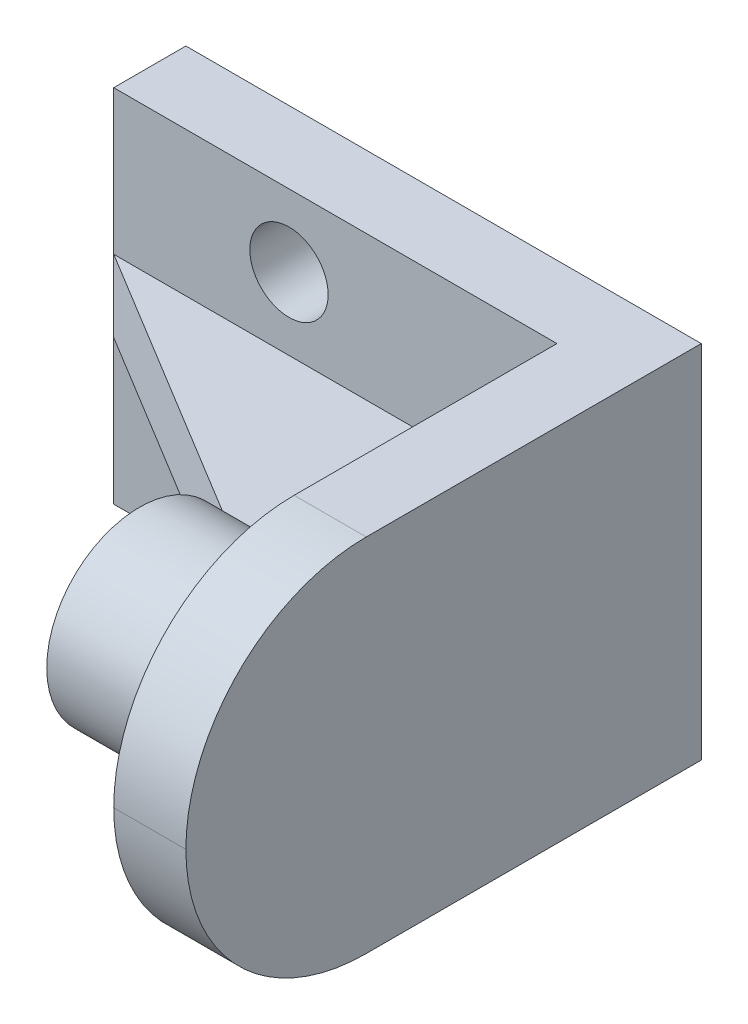
ISO-10303-21;
HEADER;
FILE_DESCRIPTION(('STEP AP214'),'2;1');
FILE_NAME('part.step','',(''),(''),'','','');
FILE_SCHEMA(('AUTOMOTIVE_DESIGN { 1 0 10303 214 1 1 1 1 }'));
ENDSEC;
DATA;
#1=APPLICATION_CONTEXT('core data for automotive mechanical design processes');
#2=APPLICATION_PROTOCOL_DEFINITION('international standard','automotive_design',2000,#1);
#3=PRODUCT_CONTEXT('',#1,'mechanical');
#4=PRODUCT('Part','Part','',(#3));
#5=PRODUCT_RELATED_PRODUCT_CATEGORY('part','',(#4));
#6=PRODUCT_DEFINITION_FORMATION('','',#4);
#7=PRODUCT_DEFINITION_CONTEXT('part definition',#1,'design');
#8=PRODUCT_DEFINITION('design','',#6,#7);
#9=PRODUCT_DEFINITION_SHAPE('','',#8);
#10=(LENGTH_UNIT() NAMED_UNIT(*) SI_UNIT(.MILLI.,.METRE.));
#11=(NAMED_UNIT(*) PLANE_ANGLE_UNIT() SI_UNIT($,.RADIAN.));
#12=(NAMED_UNIT(*) SI_UNIT($,.STERADIAN.) SOLID_ANGLE_UNIT());
#13=UNCERTAINTY_MEASURE_WITH_UNIT(LENGTH_MEASURE(1.E-05),#10,'distance_accuracy_value','');
#14=(GEOMETRIC_REPRESENTATION_CONTEXT(3) GLOBAL_UNCERTAINTY_ASSIGNED_CONTEXT((#13)) GLOBAL_UNIT_ASSIGNED_CONTEXT((#10,
#11,#12)) REPRESENTATION_CONTEXT('',''));
#15=CARTESIAN_POINT('',(0.,0.,0.));
#16=DIRECTION('',(0.,0.,1.));
#17=DIRECTION('',(1.,0.,0.));
#18=AXIS2_PLACEMENT_3D('',#15,#16,#17);
#19=CARTESIAN_POINT('',(6.00000000000001,35.01,48.));
#20=DIRECTION('',(-0.518978134241764,0.,0.854787515221729));
#21=DIRECTION('',(0.854787515221729,0.,0.518978134241764));
#22=AXIS2_PLACEMENT_3D('',#19,#20,#21);
#23=PLANE('',#22);
#24=DIRECTION('',(0.,-1.,0.));
#25=VECTOR('',#24,1.);
#26=CARTESIAN_POINT('',(-50.,35.,14.));
#27=LINE('',#26,#25);
#28=CARTESIAN_POINT('',(-50.,7.,14.));
#29=VERTEX_POINT('',#28);
#30=CARTESIAN_POINT('',(-50.,-7.,14.));
#31=VERTEX_POINT('',#30);
#32=EDGE_CURVE('E140',#29,#31,#27,.T.);
#33=ORIENTED_EDGE('',*,*,#32,.T.);
#34=DIRECTION('',(0.854787515221729,0.,0.518978134241764));
#35=VECTOR('',#34,1.);
#36=CARTESIAN_POINT('',(38.1491146318733,-7.,67.5191053122088));
#37=LINE('',#36,#35);
#38=CARTESIAN_POINT('',(6.00000000000001,-7.,48.));
#39=VERTEX_POINT('',#38);
#40=EDGE_CURVE('E161',#31,#39,#37,.T.);
#41=ORIENTED_EDGE('',*,*,#40,.T.);
#42=DIRECTION('',(0.,1.,0.));
#43=VECTOR('',#42,1.);
#44=CARTESIAN_POINT('',(6.00000000000001,0.,48.));
#45=LINE('',#44,#43);
#46=CARTESIAN_POINT('',(6.00000000000001,-5.91607978309967,48.));
#47=VERTEX_POINT('',#46);
#48=EDGE_CURVE('E172',#39,#47,#45,.T.);
#49=ORIENTED_EDGE('',*,*,#48,.T.);
#50=DIRECTION('',(0.,-1.,0.));
#51=VECTOR('',#50,1.);
#52=CARTESIAN_POINT('',(6.00000000000001,0.,48.));
#53=LINE('',#52,#51);
#54=CARTESIAN_POINT('',(6.00000000000001,5.91607978309967,48.));
#55=VERTEX_POINT('',#54);
#56=EDGE_CURVE('E195',#55,#47,#53,.T.);
#57=ORIENTED_EDGE('',*,*,#56,.F.);
#58=CARTESIAN_POINT('',(6.00000000000001,7.,48.));
#59=VERTEX_POINT('',#58);
#60=EDGE_CURVE('E176',#55,#59,#45,.T.);
#61=ORIENTED_EDGE('',*,*,#60,.T.);
#62=DIRECTION('',(-0.854787515221729,0.,-0.518978134241764));
#63=VECTOR('',#62,1.);
#64=CARTESIAN_POINT('',(38.1491146318733,7.,67.5191053122088));
#65=LINE('',#64,#63);
#66=EDGE_CURVE('E164',#59,#29,#65,.T.);
#67=ORIENTED_EDGE('',*,*,#66,.T.);
#68=EDGE_LOOP('',(#33,#41,#49,#57,#61,#67));
#69=FACE_BOUND('',#68,.T.);
#70=ADVANCED_FACE('F39',(#69),#23,.T.);
#71=CARTESIAN_POINT('',(-50.,35.,14.));
#72=DIRECTION('',(1.,0.,0.));
#73=DIRECTION('',(0.,0.,-1.));
#74=AXIS2_PLACEMENT_3D('',#71,#72,#73);
#75=PLANE('',#74);
#76=ORIENTED_EDGE('',*,*,#32,.F.);
#77=DIRECTION('',(0.,-1.,0.));
#78=VECTOR('',#77,1.);
#79=CARTESIAN_POINT('',(-50.,35.,14.));
#80=LINE('',#79,#78);
#81=CARTESIAN_POINT('',(-50.,35.,14.));
#82=VERTEX_POINT('',#81);
#83=EDGE_CURVE('E150',#82,#29,#80,.T.);
#84=ORIENTED_EDGE('',*,*,#83,.F.);
#85=DIRECTION('',(0.,0.,-1.));
#86=VECTOR('',#85,1.);
#87=CARTESIAN_POINT('',(-50.,35.,14.));
#88=LINE('',#87,#86);
#89=CARTESIAN_POINT('',(-50.,35.,0.));
#90=VERTEX_POINT('',#89);
#91=EDGE_CURVE('E243',#82,#90,#88,.T.);
#92=ORIENTED_EDGE('',*,*,#91,.T.);
#93=DIRECTION('',(0.,-1.,0.));
#94=VECTOR('',#93,1.);
#95=CARTESIAN_POINT('',(-50.,35.,0.));
#96=LINE('',#95,#94);
#97=CARTESIAN_POINT('',(-50.,-35.,0.));
#98=VERTEX_POINT('',#97);
#99=EDGE_CURVE('E258',#90,#98,#96,.T.);
#100=ORIENTED_EDGE('',*,*,#99,.T.);
#101=DIRECTION('',(0.,0.,-1.));
#102=VECTOR('',#101,1.);
#103=CARTESIAN_POINT('',(-50.,-35.,14.));
#104=LINE('',#103,#102);
#105=CARTESIAN_POINT('',(-50.,-35.,14.));
#106=VERTEX_POINT('',#105);
#107=EDGE_CURVE('E144',#106,#98,#104,.T.);
#108=ORIENTED_EDGE('',*,*,#107,.F.);
#109=EDGE_CURVE('E135',#31,#106,#80,.T.);
#110=ORIENTED_EDGE('',*,*,#109,.F.);
#111=EDGE_LOOP('',(#76,#84,#92,#100,#108,#110));
#112=FACE_BOUND('',#111,.T.);
#113=ADVANCED_FACE('F137',(#112),#75,.F.);
#114=CARTESIAN_POINT('',(50.,-7.,48.));
#115=DIRECTION('',(0.,1.,0.));
#116=DIRECTION('',(0.,0.,1.));
#117=AXIS2_PLACEMENT_3D('',#114,#115,#116);
#118=PLANE('',#117);
#119=ORIENTED_EDGE('',*,*,#40,.F.);
#120=DIRECTION('',(1.,0.,0.));
#121=VECTOR('',#120,1.);
#122=CARTESIAN_POINT('',(50.,-7.,14.));
#123=LINE('',#122,#121);
#124=CARTESIAN_POINT('',(36.,-7.,14.));
#125=VERTEX_POINT('',#124);
#126=EDGE_CURVE('E11',#31,#125,#123,.T.);
#127=ORIENTED_EDGE('',*,*,#126,.T.);
#128=DIRECTION('',(0.,0.,1.));
#129=VECTOR('',#128,1.);
#130=CARTESIAN_POINT('',(36.,-7.,100.));
#131=LINE('',#130,#129);
#132=CARTESIAN_POINT('',(36.,-7.,48.));
#133=VERTEX_POINT('',#132);
#134=EDGE_CURVE('E166',#125,#133,#131,.T.);
#135=ORIENTED_EDGE('',*,*,#134,.T.);
#136=DIRECTION('',(1.,0.,0.));
#137=VECTOR('',#136,1.);
#138=CARTESIAN_POINT('',(50.,-7.,48.));
#139=LINE('',#138,#137);
#140=EDGE_CURVE('E43',#39,#133,#139,.T.);
#141=ORIENTED_EDGE('',*,*,#140,.F.);
#142=EDGE_LOOP('',(#119,#127,#135,#141));
#143=FACE_BOUND('',#142,.T.);
#144=ADVANCED_FACE('F168',(#143),#118,.F.);
#145=CARTESIAN_POINT('',(50.,7.,48.));
#146=DIRECTION('',(0.,-1.,0.));
#147=DIRECTION('',(0.,0.,-1.));
#148=AXIS2_PLACEMENT_3D('',#145,#146,#147);
#149=PLANE('',#148);
#150=ORIENTED_EDGE('',*,*,#66,.F.);
#151=DIRECTION('',(-1.,0.,0.));
#152=VECTOR('',#151,1.);
#153=CARTESIAN_POINT('',(50.,7.,48.));
#154=LINE('',#153,#152);
#155=CARTESIAN_POINT('',(36.,7.,48.));
#156=VERTEX_POINT('',#155);
#157=EDGE_CURVE('E178',#156,#59,#154,.T.);
#158=ORIENTED_EDGE('',*,*,#157,.F.);
#159=DIRECTION('',(0.,0.,-1.));
#160=VECTOR('',#159,1.);
#161=CARTESIAN_POINT('',(36.,7.,100.));
#162=LINE('',#161,#160);
#163=CARTESIAN_POINT('',(36.,7.,14.));
#164=VERTEX_POINT('',#163);
#165=EDGE_CURVE('E198',#156,#164,#162,.T.);
#166=ORIENTED_EDGE('',*,*,#165,.T.);
#167=DIRECTION('',(-1.,0.,0.));
#168=VECTOR('',#167,1.);
#169=CARTESIAN_POINT('',(50.,7.,14.));
#170=LINE('',#169,#168);
#171=EDGE_CURVE('E49',#164,#29,#170,.T.);
#172=ORIENTED_EDGE('',*,*,#171,.T.);
#173=EDGE_LOOP('',(#150,#158,#166,#172));
#174=FACE_BOUND('',#173,.T.);
#175=ADVANCED_FACE('F325',(#174),#149,.F.);
#176=CARTESIAN_POINT('',(0.,0.,48.));
#177=DIRECTION('',(0.,0.,-1.));
#178=DIRECTION('',(-1.,0.,0.));
#179=AXIS2_PLACEMENT_3D('',#176,#177,#178);
#180=PLANE('',#179);
#181=ORIENTED_EDGE('',*,*,#48,.F.);
#182=ORIENTED_EDGE('',*,*,#140,.T.);
#183=DIRECTION('',(0.,1.,0.));
#184=VECTOR('',#183,1.);
#185=CARTESIAN_POINT('',(36.,35.,48.));
#186=LINE('',#185,#184);
#187=CARTESIAN_POINT('',(36.,-5.91607978309966,48.));
#188=VERTEX_POINT('',#187);
#189=EDGE_CURVE('E299',#133,#188,#186,.T.);
#190=ORIENTED_EDGE('',*,*,#189,.T.);
#191=DIRECTION('',(1.,0.,0.));
#192=VECTOR('',#191,1.);
#193=CARTESIAN_POINT('',(6.00000000000001,-5.91607978309967,48.));
#194=LINE('',#193,#192);
#195=EDGE_CURVE('E180',#188,#47,#194,.F.);
#196=ORIENTED_EDGE('',*,*,#195,.T.);
#197=EDGE_LOOP('',(#181,#182,#190,#196));
#198=FACE_BOUND('',#197,.T.);
#199=ADVANCED_FACE('F41',(#198),#180,.F.);
#200=ORIENTED_EDGE('',*,*,#60,.F.);
#201=DIRECTION('',(1.,0.,0.));
#202=VECTOR('',#201,1.);
#203=CARTESIAN_POINT('',(6.00000000000001,5.91607978309967,48.));
#204=LINE('',#203,#202);
#205=CARTESIAN_POINT('',(36.,5.91607978309967,48.));
#206=VERTEX_POINT('',#205);
#207=EDGE_CURVE('E185',#55,#206,#204,.T.);
#208=ORIENTED_EDGE('',*,*,#207,.T.);
#209=EDGE_CURVE('E64',#206,#156,#186,.T.);
#210=ORIENTED_EDGE('',*,*,#209,.T.);
#211=ORIENTED_EDGE('',*,*,#157,.T.);
#212=EDGE_LOOP('',(#200,#208,#210,#211));
#213=FACE_BOUND('',#212,.T.);
#214=ADVANCED_FACE('F326',(#213),#180,.F.);
#215=CARTESIAN_POINT('',(0.,0.,14.));
#216=DIRECTION('',(0.,0.,-1.));
#217=DIRECTION('',(-1.,0.,0.));
#218=AXIS2_PLACEMENT_3D('',#215,#216,#217);
#219=PLANE('',#218);
#220=CARTESIAN_POINT('',(-16.,-21.,14.));
#221=DIRECTION('',(0.,0.,1.));
#222=DIRECTION('',(1.,0.,0.));
#223=AXIS2_PLACEMENT_3D('',#220,#221,#222);
#224=CIRCLE('',#223,7.6);
#225=CARTESIAN_POINT('',(-8.4,-21.,14.));
#226=VERTEX_POINT('',#225);
#227=EDGE_CURVE('E287',#226,#226,#224,.T.);
#228=ORIENTED_EDGE('',*,*,#227,.F.);
#229=EDGE_LOOP('',(#228));
#230=FACE_BOUND('',#229,.T.);
#231=ORIENTED_EDGE('',*,*,#126,.F.);
#232=ORIENTED_EDGE('',*,*,#109,.T.);
#233=DIRECTION('',(1.,0.,0.));
#234=VECTOR('',#233,1.);
#235=CARTESIAN_POINT('',(50.,-35.,14.));
#236=LINE('',#235,#234);
#237=CARTESIAN_POINT('',(36.,-35.,14.));
#238=VERTEX_POINT('',#237);
#239=EDGE_CURVE('E264',#106,#238,#236,.T.);
#240=ORIENTED_EDGE('',*,*,#239,.T.);
#241=DIRECTION('',(0.,-1.,0.));
#242=VECTOR('',#241,1.);
#243=CARTESIAN_POINT('',(36.,35.,14.));
#244=LINE('',#243,#242);
#245=EDGE_CURVE('E154',#125,#238,#244,.T.);
#246=ORIENTED_EDGE('',*,*,#245,.F.);
#247=EDGE_LOOP('',(#231,#232,#240,#246));
#248=FACE_BOUND('',#247,.T.);
#249=ADVANCED_FACE('F153',(#230,#248),#219,.F.);
#250=CARTESIAN_POINT('',(-16.,21.,14.));
#251=DIRECTION('',(0.,0.,1.));
#252=DIRECTION('',(1.,0.,0.));
#253=AXIS2_PLACEMENT_3D('',#250,#251,#252);
#254=CIRCLE('',#253,7.6);
#255=CARTESIAN_POINT('',(-8.4,21.,14.));
#256=VERTEX_POINT('',#255);
#257=EDGE_CURVE('E278',#256,#256,#254,.T.);
#258=ORIENTED_EDGE('',*,*,#257,.F.);
#259=EDGE_LOOP('',(#258));
#260=FACE_BOUND('',#259,.T.);
#261=ORIENTED_EDGE('',*,*,#171,.F.);
#262=CARTESIAN_POINT('',(36.,35.,14.));
#263=VERTEX_POINT('',#262);
#264=EDGE_CURVE('E274',#263,#164,#244,.T.);
#265=ORIENTED_EDGE('',*,*,#264,.F.);
#266=DIRECTION('',(-1.,0.,0.));
#267=VECTOR('',#266,1.);
#268=CARTESIAN_POINT('',(50.,35.,14.));
#269=LINE('',#268,#267);
#270=EDGE_CURVE('E247',#263,#82,#269,.T.);
#271=ORIENTED_EDGE('',*,*,#270,.T.);
#272=ORIENTED_EDGE('',*,*,#83,.T.);
#273=EDGE_LOOP('',(#261,#265,#271,#272));
#274=FACE_BOUND('',#273,.T.);
#275=ADVANCED_FACE('F318',(#260,#274),#219,.F.);
#276=CARTESIAN_POINT('',(36.,35.,100.));
#277=DIRECTION('',(1.,0.,0.));
#278=DIRECTION('',(0.,1.,0.));
#279=AXIS2_PLACEMENT_3D('',#276,#277,#278);
#280=PLANE('',#279);
#281=ORIENTED_EDGE('',*,*,#134,.F.);
#282=ORIENTED_EDGE('',*,*,#245,.T.);
#283=DIRECTION('',(0.,0.,-1.));
#284=VECTOR('',#283,1.);
#285=CARTESIAN_POINT('',(36.,-35.,100.));
#286=LINE('',#285,#284);
#287=CARTESIAN_POINT('',(36.,-35.,65.));
#288=VERTEX_POINT('',#287);
#289=EDGE_CURVE('E270',#288,#238,#286,.T.);
#290=ORIENTED_EDGE('',*,*,#289,.F.);
#291=CARTESIAN_POINT('',(36.,0.,65.));
#292=DIRECTION('',(1.,0.,0.));
#293=DIRECTION('',(0.,1.,0.));
#294=AXIS2_PLACEMENT_3D('',#291,#292,#293);
#295=CIRCLE('',#294,35.);
#296=CARTESIAN_POINT('',(36.,0.,100.));
#297=VERTEX_POINT('',#296);
#298=EDGE_CURVE('E204',#288,#297,#295,.F.);
#299=ORIENTED_EDGE('',*,*,#298,.T.);
#300=CARTESIAN_POINT('',(36.,0.,65.));
#301=DIRECTION('',(1.,0.,0.));
#302=DIRECTION('',(0.,1.,0.));
#303=AXIS2_PLACEMENT_3D('',#300,#301,#302);
#304=CIRCLE('',#303,35.);
#305=CARTESIAN_POINT('',(36.,35.,65.));
#306=VERTEX_POINT('',#305);
#307=EDGE_CURVE('E228',#297,#306,#304,.F.);
#308=ORIENTED_EDGE('',*,*,#307,.T.);
#309=DIRECTION('',(0.,0.,-1.));
#310=VECTOR('',#309,1.);
#311=CARTESIAN_POINT('',(36.,35.,100.));
#312=LINE('',#311,#310);
#313=EDGE_CURVE('E261',#306,#263,#312,.T.);
#314=ORIENTED_EDGE('',*,*,#313,.T.);
#315=ORIENTED_EDGE('',*,*,#264,.T.);
#316=ORIENTED_EDGE('',*,*,#165,.F.);
#317=ORIENTED_EDGE('',*,*,#209,.F.);
#318=CARTESIAN_POINT('',(36.,0.,65.));
#319=DIRECTION('',(1.,0.,0.));
#320=DIRECTION('',(0.,1.,0.));
#321=AXIS2_PLACEMENT_3D('',#318,#319,#320);
#322=CIRCLE('',#321,18.);
#323=EDGE_CURVE('E197',#188,#206,#322,.F.);
#324=ORIENTED_EDGE('',*,*,#323,.F.);
#325=ORIENTED_EDGE('',*,*,#189,.F.);
#326=EDGE_LOOP('',(#281,#282,#290,#299,#308,#314,#315,#316,#317,#324,#325));
#327=FACE_BOUND('',#326,.T.);
#328=ADVANCED_FACE('F313',(#327),#280,.F.);
#329=CARTESIAN_POINT('',(6.00000000000001,0.,65.));
#330=DIRECTION('',(1.,0.,0.));
#331=DIRECTION('',(0.,1.,0.));
#332=AXIS2_PLACEMENT_3D('',#329,#330,#331);
#333=CYLINDRICAL_SURFACE('',#332,18.);
#334=ORIENTED_EDGE('',*,*,#207,.F.);
#335=CARTESIAN_POINT('',(6.00000000000001,0.,65.));
#336=DIRECTION('',(-1.,0.,0.));
#337=DIRECTION('',(0.,-1.,0.));
#338=AXIS2_PLACEMENT_3D('',#335,#336,#337);
#339=CIRCLE('',#338,18.);
#340=EDGE_CURVE('E291',#47,#55,#339,.T.);
#341=ORIENTED_EDGE('',*,*,#340,.F.);
#342=ORIENTED_EDGE('',*,*,#195,.F.);
#343=ORIENTED_EDGE('',*,*,#323,.T.);
#344=EDGE_LOOP('',(#334,#341,#342,#343));
#345=FACE_BOUND('',#344,.T.);
#346=ADVANCED_FACE('F312',(#345),#333,.T.);
#347=CARTESIAN_POINT('',(6.00000000000001,0.,0.));
#348=DIRECTION('',(-1.,0.,0.));
#349=DIRECTION('',(0.,-1.,0.));
#350=AXIS2_PLACEMENT_3D('',#347,#348,#349);
#351=PLANE('',#350);
#352=CARTESIAN_POINT('',(6.00000000000001,0.,65.));
#353=DIRECTION('',(-1.,0.,0.));
#354=DIRECTION('',(0.,-1.,0.));
#355=AXIS2_PLACEMENT_3D('',#352,#353,#354);
#356=CIRCLE('',#355,9.99999999999999);
#357=CARTESIAN_POINT('',(6.00000000000001,-10.,65.));
#358=VERTEX_POINT('',#357);
#359=EDGE_CURVE('E300',#358,#358,#356,.T.);
#360=ORIENTED_EDGE('',*,*,#359,.F.);
#361=EDGE_LOOP('',(#360));
#362=FACE_BOUND('',#361,.T.);
#363=ORIENTED_EDGE('',*,*,#340,.T.);
#364=ORIENTED_EDGE('',*,*,#56,.T.);
#365=EDGE_LOOP('',(#363,#364));
#366=FACE_BOUND('',#365,.T.);
#367=ADVANCED_FACE('F327',(#362,#366),#351,.T.);
#368=CARTESIAN_POINT('',(50.,-35.,14.));
#369=DIRECTION('',(0.,1.,0.));
#370=DIRECTION('',(-1.,0.,0.));
#371=AXIS2_PLACEMENT_3D('',#368,#369,#370);
#372=PLANE('',#371);
#373=DIRECTION('',(0.,0.,-1.));
#374=VECTOR('',#373,1.);
#375=CARTESIAN_POINT('',(50.,-35.,14.));
#376=LINE('',#375,#374);
#377=CARTESIAN_POINT('',(50.,-35.,65.));
#378=VERTEX_POINT('',#377);
#379=CARTESIAN_POINT('',(50.,-35.,0.));
#380=VERTEX_POINT('',#379);
#381=EDGE_CURVE('E237',#378,#380,#376,.T.);
#382=ORIENTED_EDGE('',*,*,#381,.F.);
#383=DIRECTION('',(1.,0.,0.));
#384=VECTOR('',#383,1.);
#385=CARTESIAN_POINT('',(50.,-35.,65.));
#386=LINE('',#385,#384);
#387=EDGE_CURVE('E215',#378,#288,#386,.F.);
#388=ORIENTED_EDGE('',*,*,#387,.T.);
#389=ORIENTED_EDGE('',*,*,#289,.T.);
#390=ORIENTED_EDGE('',*,*,#239,.F.);
#391=ORIENTED_EDGE('',*,*,#107,.T.);
#392=DIRECTION('',(1.,0.,0.));
#393=VECTOR('',#392,1.);
#394=CARTESIAN_POINT('',(50.,-35.,0.));
#395=LINE('',#394,#393);
#396=EDGE_CURVE('E254',#98,#380,#395,.T.);
#397=ORIENTED_EDGE('',*,*,#396,.T.);
#398=EDGE_LOOP('',(#382,#388,#389,#390,#391,#397));
#399=FACE_BOUND('',#398,.T.);
#400=ADVANCED_FACE('F329',(#399),#372,.F.);
#401=CARTESIAN_POINT('',(50.,35.,14.));
#402=DIRECTION('',(-1.,0.,0.));
#403=DIRECTION('',(0.,-1.,0.));
#404=AXIS2_PLACEMENT_3D('',#401,#402,#403);
#405=PLANE('',#404);
#406=CARTESIAN_POINT('',(50.,0.,65.));
#407=DIRECTION('',(-1.,0.,0.));
#408=DIRECTION('',(0.,-1.,0.));
#409=AXIS2_PLACEMENT_3D('',#406,#407,#408);
#410=CIRCLE('',#409,35.);
#411=CARTESIAN_POINT('',(50.,35.,65.));
#412=VERTEX_POINT('',#411);
#413=CARTESIAN_POINT('',(50.,0.,100.));
#414=VERTEX_POINT('',#413);
#415=EDGE_CURVE('E221',#412,#414,#410,.F.);
#416=ORIENTED_EDGE('',*,*,#415,.T.);
#417=CARTESIAN_POINT('',(50.,0.,65.));
#418=DIRECTION('',(-1.,0.,0.));
#419=DIRECTION('',(0.,-1.,0.));
#420=AXIS2_PLACEMENT_3D('',#417,#418,#419);
#421=CIRCLE('',#420,35.);
#422=EDGE_CURVE('E218',#414,#378,#421,.F.);
#423=ORIENTED_EDGE('',*,*,#422,.T.);
#424=ORIENTED_EDGE('',*,*,#381,.T.);
#425=DIRECTION('',(0.,1.,0.));
#426=VECTOR('',#425,1.);
#427=CARTESIAN_POINT('',(50.,35.,0.));
#428=LINE('',#427,#426);
#429=CARTESIAN_POINT('',(50.,35.,0.));
#430=VERTEX_POINT('',#429);
#431=EDGE_CURVE('E250',#380,#430,#428,.T.);
#432=ORIENTED_EDGE('',*,*,#431,.T.);
#433=DIRECTION('',(0.,0.,-1.));
#434=VECTOR('',#433,1.);
#435=CARTESIAN_POINT('',(50.,35.,14.));
#436=LINE('',#435,#434);
#437=EDGE_CURVE('E240',#412,#430,#436,.T.);
#438=ORIENTED_EDGE('',*,*,#437,.F.);
#439=EDGE_LOOP('',(#416,#423,#424,#432,#438));
#440=FACE_BOUND('',#439,.T.);
#441=ADVANCED_FACE('F336',(#440),#405,.F.);
#442=CARTESIAN_POINT('',(50.,35.,14.));
#443=DIRECTION('',(0.,-1.,0.));
#444=DIRECTION('',(1.,0.,0.));
#445=AXIS2_PLACEMENT_3D('',#442,#443,#444);
#446=PLANE('',#445);
#447=ORIENTED_EDGE('',*,*,#313,.F.);
#448=DIRECTION('',(-1.,0.,0.));
#449=VECTOR('',#448,1.);
#450=CARTESIAN_POINT('',(50.,35.,65.));
#451=LINE('',#450,#449);
#452=EDGE_CURVE('E225',#306,#412,#451,.F.);
#453=ORIENTED_EDGE('',*,*,#452,.T.);
#454=ORIENTED_EDGE('',*,*,#437,.T.);
#455=DIRECTION('',(-1.,0.,0.));
#456=VECTOR('',#455,1.);
#457=CARTESIAN_POINT('',(50.,35.,0.));
#458=LINE('',#457,#456);
#459=EDGE_CURVE('E149',#430,#90,#458,.T.);
#460=ORIENTED_EDGE('',*,*,#459,.T.);
#461=ORIENTED_EDGE('',*,*,#91,.F.);
#462=ORIENTED_EDGE('',*,*,#270,.F.);
#463=EDGE_LOOP('',(#447,#453,#454,#460,#461,#462));
#464=FACE_BOUND('',#463,.T.);
#465=ADVANCED_FACE('F321',(#464),#446,.F.);
#466=CARTESIAN_POINT('',(0.,0.,0.));
#467=DIRECTION('',(0.,0.,-1.));
#468=DIRECTION('',(-1.,0.,0.));
#469=AXIS2_PLACEMENT_3D('',#466,#467,#468);
#470=PLANE('',#469);
#471=CARTESIAN_POINT('',(-16.,-21.,0.));
#472=DIRECTION('',(0.,0.,1.));
#473=DIRECTION('',(1.,0.,0.));
#474=AXIS2_PLACEMENT_3D('',#471,#472,#473);
#475=CIRCLE('',#474,7.6);
#476=CARTESIAN_POINT('',(-8.4,-21.,0.));
#477=VERTEX_POINT('',#476);
#478=EDGE_CURVE('E282',#477,#477,#475,.T.);
#479=ORIENTED_EDGE('',*,*,#478,.T.);
#480=EDGE_LOOP('',(#479));
#481=FACE_BOUND('',#480,.T.);
#482=CARTESIAN_POINT('',(-16.,21.,0.));
#483=DIRECTION('',(0.,0.,1.));
#484=DIRECTION('',(1.,0.,0.));
#485=AXIS2_PLACEMENT_3D('',#482,#483,#484);
#486=CIRCLE('',#485,7.6);
#487=CARTESIAN_POINT('',(-8.4,21.,0.));
#488=VERTEX_POINT('',#487);
#489=EDGE_CURVE('E283',#488,#488,#486,.T.);
#490=ORIENTED_EDGE('',*,*,#489,.T.);
#491=EDGE_LOOP('',(#490));
#492=FACE_BOUND('',#491,.T.);
#493=ORIENTED_EDGE('',*,*,#99,.F.);
#494=ORIENTED_EDGE('',*,*,#459,.F.);
#495=ORIENTED_EDGE('',*,*,#431,.F.);
#496=ORIENTED_EDGE('',*,*,#396,.F.);
#497=EDGE_LOOP('',(#493,#494,#495,#496));
#498=FACE_BOUND('',#497,.T.);
#499=ADVANCED_FACE('F369',(#481,#492,#498),#470,.T.);
#500=CARTESIAN_POINT('',(0.,0.,65.));
#501=DIRECTION('',(-1.,0.,0.));
#502=DIRECTION('',(0.,-1.,0.));
#503=AXIS2_PLACEMENT_3D('',#500,#501,#502);
#504=CYLINDRICAL_SURFACE('',#503,35.);
#505=ORIENTED_EDGE('',*,*,#415,.F.);
#506=ORIENTED_EDGE('',*,*,#452,.F.);
#507=ORIENTED_EDGE('',*,*,#307,.F.);
#508=DIRECTION('',(-1.,0.,0.));
#509=VECTOR('',#508,1.);
#510=CARTESIAN_POINT('',(0.,0.,100.));
#511=LINE('',#510,#509);
#512=EDGE_CURVE('E231',#414,#297,#511,.T.);
#513=ORIENTED_EDGE('',*,*,#512,.F.);
#514=EDGE_LOOP('',(#505,#506,#507,#513));
#515=FACE_BOUND('',#514,.T.);
#516=ADVANCED_FACE('F419',(#515),#504,.T.);
#517=CARTESIAN_POINT('',(0.,0.,65.));
#518=DIRECTION('',(1.,0.,0.));
#519=DIRECTION('',(0.,1.,0.));
#520=AXIS2_PLACEMENT_3D('',#517,#518,#519);
#521=CYLINDRICAL_SURFACE('',#520,35.);
#522=ORIENTED_EDGE('',*,*,#298,.F.);
#523=ORIENTED_EDGE('',*,*,#387,.F.);
#524=ORIENTED_EDGE('',*,*,#422,.F.);
#525=ORIENTED_EDGE('',*,*,#512,.T.);
#526=EDGE_LOOP('',(#522,#523,#524,#525));
#527=FACE_BOUND('',#526,.T.);
#528=ADVANCED_FACE('F377',(#527),#521,.T.);
#529=CARTESIAN_POINT('',(-16.,21.,0.));
#530=DIRECTION('',(0.,0.,1.));
#531=DIRECTION('',(1.,0.,0.));
#532=AXIS2_PLACEMENT_3D('',#529,#530,#531);
#533=CYLINDRICAL_SURFACE('',#532,7.6);
#534=ORIENTED_EDGE('',*,*,#489,.F.);
#535=EDGE_LOOP('',(#534));
#536=FACE_BOUND('',#535,.T.);
#537=ORIENTED_EDGE('',*,*,#257,.T.);
#538=EDGE_LOOP('',(#537));
#539=FACE_BOUND('',#538,.T.);
#540=ADVANCED_FACE('F373',(#536,#539),#533,.F.);
#541=CARTESIAN_POINT('',(-16.,-21.,0.));
#542=DIRECTION('',(0.,0.,1.));
#543=DIRECTION('',(1.,0.,0.));
#544=AXIS2_PLACEMENT_3D('',#541,#542,#543);
#545=CYLINDRICAL_SURFACE('',#544,7.6);
#546=ORIENTED_EDGE('',*,*,#478,.F.);
#547=EDGE_LOOP('',(#546));
#548=FACE_BOUND('',#547,.T.);
#549=ORIENTED_EDGE('',*,*,#227,.T.);
#550=EDGE_LOOP('',(#549));
#551=FACE_BOUND('',#550,.T.);
#552=ADVANCED_FACE('F376',(#548,#551),#545,.F.);
#553=CARTESIAN_POINT('',(6.00000000000001,0.,65.));
#554=DIRECTION('',(1.,0.,0.));
#555=DIRECTION('',(0.,1.,0.));
#556=AXIS2_PLACEMENT_3D('',#553,#554,#555);
#557=CYLINDRICAL_SURFACE('',#556,9.99999999999999);
#558=ORIENTED_EDGE('',*,*,#359,.T.);
#559=EDGE_LOOP('',(#558));
#560=FACE_BOUND('',#559,.T.);
#561=CARTESIAN_POINT('',(36.,0.,65.));
#562=DIRECTION('',(-1.,0.,0.));
#563=DIRECTION('',(0.,-1.,0.));
#564=AXIS2_PLACEMENT_3D('',#561,#562,#563);
#565=CIRCLE('',#564,9.99999999999999);
#566=CARTESIAN_POINT('',(36.,-9.99999999999999,65.));
#567=VERTEX_POINT('',#566);
#568=EDGE_CURVE('E295',#567,#567,#565,.T.);
#569=ORIENTED_EDGE('',*,*,#568,.F.);
#570=EDGE_LOOP('',(#569));
#571=FACE_BOUND('',#570,.T.);
#572=ADVANCED_FACE('F381',(#560,#571),#557,.F.);
#573=ORIENTED_EDGE('',*,*,#568,.T.);
#574=EDGE_LOOP('',(#573));
#575=FACE_BOUND('',#574,.T.);
#576=ADVANCED_FACE('F348',(#575),#280,.F.);
#577=CLOSED_SHELL('',(#70,#113,#144,#175,#199,#214,#249,#275,#328,#346,#367,#400,#441,#465,#499,
#516,#528,#540,#552,#572,#576));
#578=MANIFOLD_SOLID_BREP('B2',#577);
#579=ADVANCED_BREP_SHAPE_REPRESENTATION('',(#18,#578),#14);
#580=SHAPE_DEFINITION_REPRESENTATION(#9,#579);
ENDSEC;
END-ISO-10303-21;
